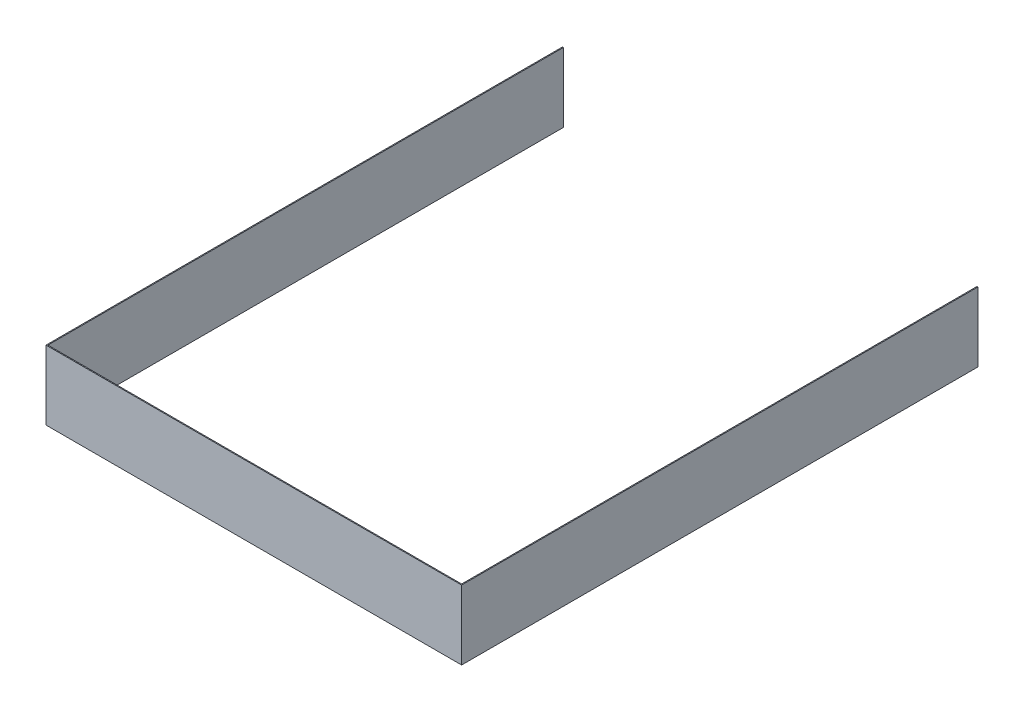
ISO-10303-21;
HEADER;
FILE_DESCRIPTION(('STEP AP214'),'2;1');
FILE_NAME('part.step','',(''),(''),'','','');
FILE_SCHEMA(('AUTOMOTIVE_DESIGN { 1 0 10303 214 1 1 1 1 }'));
ENDSEC;
DATA;
#1=APPLICATION_CONTEXT('core data for automotive mechanical design processes');
#2=APPLICATION_PROTOCOL_DEFINITION('international standard','automotive_design',2000,#1);
#3=PRODUCT_CONTEXT('',#1,'mechanical');
#4=PRODUCT('Part','Part','',(#3));
#5=PRODUCT_RELATED_PRODUCT_CATEGORY('part','',(#4));
#6=PRODUCT_DEFINITION_FORMATION('','',#4);
#7=PRODUCT_DEFINITION_CONTEXT('part definition',#1,'design');
#8=PRODUCT_DEFINITION('design','',#6,#7);
#9=PRODUCT_DEFINITION_SHAPE('','',#8);
#10=(LENGTH_UNIT() NAMED_UNIT(*) SI_UNIT(.MILLI.,.METRE.));
#11=(NAMED_UNIT(*) PLANE_ANGLE_UNIT() SI_UNIT($,.RADIAN.));
#12=(NAMED_UNIT(*) SI_UNIT($,.STERADIAN.) SOLID_ANGLE_UNIT());
#13=UNCERTAINTY_MEASURE_WITH_UNIT(LENGTH_MEASURE(1.E-05),#10,'distance_accuracy_value','');
#14=(GEOMETRIC_REPRESENTATION_CONTEXT(3) GLOBAL_UNCERTAINTY_ASSIGNED_CONTEXT((#13)) GLOBAL_UNIT_ASSIGNED_CONTEXT((#10,
#11,#12)) REPRESENTATION_CONTEXT('',''));
#15=CARTESIAN_POINT('',(0.,0.,0.));
#16=DIRECTION('',(0.,0.,1.));
#17=DIRECTION('',(1.,0.,0.));
#18=AXIS2_PLACEMENT_3D('',#15,#16,#17);
#19=CARTESIAN_POINT('',(21.5,120.,-800.));
#20=DIRECTION('',(0.,0.,1.));
#21=DIRECTION('',(1.,0.,0.));
#22=AXIS2_PLACEMENT_3D('',#19,#20,#21);
#23=PLANE('',#22);
#24=DIRECTION('',(-1.,0.,0.));
#25=VECTOR('',#24,1.);
#26=CARTESIAN_POINT('',(21.5,10.,-800.));
#27=LINE('',#26,#25);
#28=CARTESIAN_POINT('',(21.5,10.,-800.));
#29=VERTEX_POINT('',#28);
#30=CARTESIAN_POINT('',(20.,10.,-800.));
#31=VERTEX_POINT('',#30);
#32=EDGE_CURVE('E135',#29,#31,#27,.T.);
#33=ORIENTED_EDGE('',*,*,#32,.T.);
#34=DIRECTION('',(0.,-1.,0.));
#35=VECTOR('',#34,1.);
#36=CARTESIAN_POINT('',(20.,120.,-800.));
#37=LINE('',#36,#35);
#38=CARTESIAN_POINT('',(20.,120.,-800.));
#39=VERTEX_POINT('',#38);
#40=EDGE_CURVE('E11',#39,#31,#37,.T.);
#41=ORIENTED_EDGE('',*,*,#40,.F.);
#42=DIRECTION('',(-1.,0.,0.));
#43=VECTOR('',#42,1.);
#44=CARTESIAN_POINT('',(21.5,120.,-800.));
#45=LINE('',#44,#43);
#46=CARTESIAN_POINT('',(21.5,120.,-800.));
#47=VERTEX_POINT('',#46);
#48=EDGE_CURVE('E149',#47,#39,#45,.T.);
#49=ORIENTED_EDGE('',*,*,#48,.F.);
#50=DIRECTION('',(0.,-1.,0.));
#51=VECTOR('',#50,1.);
#52=CARTESIAN_POINT('',(21.5,120.,-800.));
#53=LINE('',#52,#51);
#54=EDGE_CURVE('E131',#47,#29,#53,.T.);
#55=ORIENTED_EDGE('',*,*,#54,.T.);
#56=EDGE_LOOP('',(#33,#41,#49,#55));
#57=FACE_BOUND('',#56,.T.);
#58=ADVANCED_FACE('F39',(#57),#23,.F.);
#59=CARTESIAN_POINT('',(20.,120.,-800.));
#60=DIRECTION('',(1.,0.,0.));
#61=DIRECTION('',(0.,0.,-1.));
#62=AXIS2_PLACEMENT_3D('',#59,#60,#61);
#63=PLANE('',#62);
#64=DIRECTION('',(0.,0.,1.));
#65=VECTOR('',#64,1.);
#66=CARTESIAN_POINT('',(20.,10.,-800.));
#67=LINE('',#66,#65);
#68=CARTESIAN_POINT('',(20.,10.,20.));
#69=VERTEX_POINT('',#68);
#70=EDGE_CURVE('E138',#31,#69,#67,.T.);
#71=ORIENTED_EDGE('',*,*,#70,.T.);
#72=DIRECTION('',(0.,-1.,0.));
#73=VECTOR('',#72,1.);
#74=CARTESIAN_POINT('',(20.,120.,20.));
#75=LINE('',#74,#73);
#76=CARTESIAN_POINT('',(20.,120.,20.));
#77=VERTEX_POINT('',#76);
#78=EDGE_CURVE('E47',#77,#69,#75,.T.);
#79=ORIENTED_EDGE('',*,*,#78,.F.);
#80=DIRECTION('',(0.,0.,1.));
#81=VECTOR('',#80,1.);
#82=CARTESIAN_POINT('',(20.,120.,-800.));
#83=LINE('',#82,#81);
#84=EDGE_CURVE('E98',#39,#77,#83,.T.);
#85=ORIENTED_EDGE('',*,*,#84,.F.);
#86=ORIENTED_EDGE('',*,*,#40,.T.);
#87=EDGE_LOOP('',(#71,#79,#85,#86));
#88=FACE_BOUND('',#87,.T.);
#89=ADVANCED_FACE('F184',(#88),#63,.F.);
#90=CARTESIAN_POINT('',(20.,120.,20.));
#91=DIRECTION('',(0.,0.,-1.));
#92=DIRECTION('',(-1.,0.,0.));
#93=AXIS2_PLACEMENT_3D('',#90,#91,#92);
#94=PLANE('',#93);
#95=DIRECTION('',(1.,0.,0.));
#96=VECTOR('',#95,1.);
#97=CARTESIAN_POINT('',(20.,10.,20.));
#98=LINE('',#97,#96);
#99=CARTESIAN_POINT('',(680.,10.,20.));
#100=VERTEX_POINT('',#99);
#101=EDGE_CURVE('E140',#69,#100,#98,.T.);
#102=ORIENTED_EDGE('',*,*,#101,.T.);
#103=DIRECTION('',(0.,-1.,0.));
#104=VECTOR('',#103,1.);
#105=CARTESIAN_POINT('',(680.,120.,20.));
#106=LINE('',#105,#104);
#107=CARTESIAN_POINT('',(680.,120.,20.));
#108=VERTEX_POINT('',#107);
#109=EDGE_CURVE('E156',#108,#100,#106,.T.);
#110=ORIENTED_EDGE('',*,*,#109,.F.);
#111=DIRECTION('',(1.,0.,0.));
#112=VECTOR('',#111,1.);
#113=CARTESIAN_POINT('',(20.,120.,20.));
#114=LINE('',#113,#112);
#115=EDGE_CURVE('E164',#77,#108,#114,.T.);
#116=ORIENTED_EDGE('',*,*,#115,.F.);
#117=ORIENTED_EDGE('',*,*,#78,.T.);
#118=EDGE_LOOP('',(#102,#110,#116,#117));
#119=FACE_BOUND('',#118,.T.);
#120=ADVANCED_FACE('F162',(#119),#94,.F.);
#121=CARTESIAN_POINT('',(680.,120.,20.));
#122=DIRECTION('',(-1.,0.,0.));
#123=DIRECTION('',(0.,0.,1.));
#124=AXIS2_PLACEMENT_3D('',#121,#122,#123);
#125=PLANE('',#124);
#126=DIRECTION('',(0.,0.,-1.));
#127=VECTOR('',#126,1.);
#128=CARTESIAN_POINT('',(680.,10.,20.));
#129=LINE('',#128,#127);
#130=CARTESIAN_POINT('',(680.,10.,-800.));
#131=VERTEX_POINT('',#130);
#132=EDGE_CURVE('E142',#100,#131,#129,.T.);
#133=ORIENTED_EDGE('',*,*,#132,.T.);
#134=DIRECTION('',(0.,-1.,0.));
#135=VECTOR('',#134,1.);
#136=CARTESIAN_POINT('',(680.,120.,-800.));
#137=LINE('',#136,#135);
#138=CARTESIAN_POINT('',(680.,120.,-800.));
#139=VERTEX_POINT('',#138);
#140=EDGE_CURVE('E153',#139,#131,#137,.T.);
#141=ORIENTED_EDGE('',*,*,#140,.F.);
#142=DIRECTION('',(0.,0.,-1.));
#143=VECTOR('',#142,1.);
#144=CARTESIAN_POINT('',(680.,120.,20.));
#145=LINE('',#144,#143);
#146=EDGE_CURVE('E176',#108,#139,#145,.T.);
#147=ORIENTED_EDGE('',*,*,#146,.F.);
#148=ORIENTED_EDGE('',*,*,#109,.T.);
#149=EDGE_LOOP('',(#133,#141,#147,#148));
#150=FACE_BOUND('',#149,.T.);
#151=ADVANCED_FACE('F172',(#150),#125,.F.);
#152=CARTESIAN_POINT('',(680.,120.,-800.));
#153=DIRECTION('',(0.,0.,1.));
#154=DIRECTION('',(1.,0.,0.));
#155=AXIS2_PLACEMENT_3D('',#152,#153,#154);
#156=PLANE('',#155);
#157=DIRECTION('',(-1.,0.,0.));
#158=VECTOR('',#157,1.);
#159=CARTESIAN_POINT('',(680.,10.,-800.));
#160=LINE('',#159,#158);
#161=CARTESIAN_POINT('',(678.5,10.,-800.));
#162=VERTEX_POINT('',#161);
#163=EDGE_CURVE('E144',#131,#162,#160,.T.);
#164=ORIENTED_EDGE('',*,*,#163,.T.);
#165=DIRECTION('',(0.,-1.,0.));
#166=VECTOR('',#165,1.);
#167=CARTESIAN_POINT('',(678.5,120.,-800.));
#168=LINE('',#167,#166);
#169=CARTESIAN_POINT('',(678.5,120.,-800.));
#170=VERTEX_POINT('',#169);
#171=EDGE_CURVE('E126',#170,#162,#168,.T.);
#172=ORIENTED_EDGE('',*,*,#171,.F.);
#173=DIRECTION('',(-1.,0.,0.));
#174=VECTOR('',#173,1.);
#175=CARTESIAN_POINT('',(680.,120.,-800.));
#176=LINE('',#175,#174);
#177=EDGE_CURVE('E117',#139,#170,#176,.T.);
#178=ORIENTED_EDGE('',*,*,#177,.F.);
#179=ORIENTED_EDGE('',*,*,#140,.T.);
#180=EDGE_LOOP('',(#164,#172,#178,#179));
#181=FACE_BOUND('',#180,.T.);
#182=ADVANCED_FACE('F175',(#181),#156,.F.);
#183=CARTESIAN_POINT('',(678.5,120.,-800.));
#184=DIRECTION('',(1.,0.,0.));
#185=DIRECTION('',(0.,0.,-1.));
#186=AXIS2_PLACEMENT_3D('',#183,#184,#185);
#187=PLANE('',#186);
#188=DIRECTION('',(0.,0.,1.));
#189=VECTOR('',#188,1.);
#190=CARTESIAN_POINT('',(678.5,10.,-800.));
#191=LINE('',#190,#189);
#192=CARTESIAN_POINT('',(678.5,10.,18.5));
#193=VERTEX_POINT('',#192);
#194=EDGE_CURVE('E125',#162,#193,#191,.T.);
#195=ORIENTED_EDGE('',*,*,#194,.T.);
#196=DIRECTION('',(0.,-1.,0.));
#197=VECTOR('',#196,1.);
#198=CARTESIAN_POINT('',(678.5,120.,18.5));
#199=LINE('',#198,#197);
#200=CARTESIAN_POINT('',(678.5,120.,18.5));
#201=VERTEX_POINT('',#200);
#202=EDGE_CURVE('E122',#201,#193,#199,.T.);
#203=ORIENTED_EDGE('',*,*,#202,.F.);
#204=DIRECTION('',(0.,0.,1.));
#205=VECTOR('',#204,1.);
#206=CARTESIAN_POINT('',(678.5,120.,-800.));
#207=LINE('',#206,#205);
#208=EDGE_CURVE('E111',#170,#201,#207,.T.);
#209=ORIENTED_EDGE('',*,*,#208,.F.);
#210=ORIENTED_EDGE('',*,*,#171,.T.);
#211=EDGE_LOOP('',(#195,#203,#209,#210));
#212=FACE_BOUND('',#211,.T.);
#213=ADVANCED_FACE('F123',(#212),#187,.F.);
#214=CARTESIAN_POINT('',(678.5,120.,18.5));
#215=DIRECTION('',(0.,0.,1.));
#216=DIRECTION('',(1.,0.,0.));
#217=AXIS2_PLACEMENT_3D('',#214,#215,#216);
#218=PLANE('',#217);
#219=DIRECTION('',(-1.,0.,0.));
#220=VECTOR('',#219,1.);
#221=CARTESIAN_POINT('',(678.5,10.,18.5));
#222=LINE('',#221,#220);
#223=CARTESIAN_POINT('',(21.5,10.,18.5));
#224=VERTEX_POINT('',#223);
#225=EDGE_CURVE('E84',#193,#224,#222,.T.);
#226=ORIENTED_EDGE('',*,*,#225,.T.);
#227=DIRECTION('',(0.,-1.,0.));
#228=VECTOR('',#227,1.);
#229=CARTESIAN_POINT('',(21.5,120.,18.5));
#230=LINE('',#229,#228);
#231=CARTESIAN_POINT('',(21.5,120.,18.5));
#232=VERTEX_POINT('',#231);
#233=EDGE_CURVE('E127',#232,#224,#230,.T.);
#234=ORIENTED_EDGE('',*,*,#233,.F.);
#235=DIRECTION('',(-1.,0.,0.));
#236=VECTOR('',#235,1.);
#237=CARTESIAN_POINT('',(678.5,120.,18.5));
#238=LINE('',#237,#236);
#239=EDGE_CURVE('E115',#201,#232,#238,.T.);
#240=ORIENTED_EDGE('',*,*,#239,.F.);
#241=ORIENTED_EDGE('',*,*,#202,.T.);
#242=EDGE_LOOP('',(#226,#234,#240,#241));
#243=FACE_BOUND('',#242,.T.);
#244=ADVANCED_FACE('F129',(#243),#218,.F.);
#245=CARTESIAN_POINT('',(21.5,120.,18.5));
#246=DIRECTION('',(-1.,0.,0.));
#247=DIRECTION('',(0.,0.,1.));
#248=AXIS2_PLACEMENT_3D('',#245,#246,#247);
#249=PLANE('',#248);
#250=DIRECTION('',(0.,0.,-1.));
#251=VECTOR('',#250,1.);
#252=CARTESIAN_POINT('',(21.5,10.,18.5));
#253=LINE('',#252,#251);
#254=EDGE_CURVE('E90',#224,#29,#253,.T.);
#255=ORIENTED_EDGE('',*,*,#254,.T.);
#256=ORIENTED_EDGE('',*,*,#54,.F.);
#257=DIRECTION('',(0.,0.,-1.));
#258=VECTOR('',#257,1.);
#259=CARTESIAN_POINT('',(21.5,120.,18.5));
#260=LINE('',#259,#258);
#261=EDGE_CURVE('E55',#232,#47,#260,.T.);
#262=ORIENTED_EDGE('',*,*,#261,.F.);
#263=ORIENTED_EDGE('',*,*,#233,.T.);
#264=EDGE_LOOP('',(#255,#256,#262,#263));
#265=FACE_BOUND('',#264,.T.);
#266=ADVANCED_FACE('F200',(#265),#249,.F.);
#267=CARTESIAN_POINT('',(0.,120.,0.));
#268=DIRECTION('',(0.,1.,0.));
#269=DIRECTION('',(0.,0.,1.));
#270=AXIS2_PLACEMENT_3D('',#267,#268,#269);
#271=PLANE('',#270);
#272=ORIENTED_EDGE('',*,*,#48,.T.);
#273=ORIENTED_EDGE('',*,*,#84,.T.);
#274=ORIENTED_EDGE('',*,*,#115,.T.);
#275=ORIENTED_EDGE('',*,*,#146,.T.);
#276=ORIENTED_EDGE('',*,*,#177,.T.);
#277=ORIENTED_EDGE('',*,*,#208,.T.);
#278=ORIENTED_EDGE('',*,*,#239,.T.);
#279=ORIENTED_EDGE('',*,*,#261,.T.);
#280=EDGE_LOOP('',(#272,#273,#274,#275,#276,#277,#278,#279));
#281=FACE_BOUND('',#280,.T.);
#282=ADVANCED_FACE('F113',(#281),#271,.T.);
#283=CARTESIAN_POINT('',(0.,10.,0.));
#284=DIRECTION('',(0.,1.,0.));
#285=DIRECTION('',(0.,0.,1.));
#286=AXIS2_PLACEMENT_3D('',#283,#284,#285);
#287=PLANE('',#286);
#288=ORIENTED_EDGE('',*,*,#32,.F.);
#289=ORIENTED_EDGE('',*,*,#254,.F.);
#290=ORIENTED_EDGE('',*,*,#225,.F.);
#291=ORIENTED_EDGE('',*,*,#194,.F.);
#292=ORIENTED_EDGE('',*,*,#163,.F.);
#293=ORIENTED_EDGE('',*,*,#132,.F.);
#294=ORIENTED_EDGE('',*,*,#101,.F.);
#295=ORIENTED_EDGE('',*,*,#70,.F.);
#296=EDGE_LOOP('',(#288,#289,#290,#291,#292,#293,#294,#295));
#297=FACE_BOUND('',#296,.T.);
#298=ADVANCED_FACE('F168',(#297),#287,.F.);
#299=CLOSED_SHELL('',(#58,#89,#120,#151,#182,#213,#244,#266,#282,#298));
#300=MANIFOLD_SOLID_BREP('B2',#299);
#301=ADVANCED_BREP_SHAPE_REPRESENTATION('',(#18,#300),#14);
#302=SHAPE_DEFINITION_REPRESENTATION(#9,#301);
ENDSEC;
END-ISO-10303-21;
